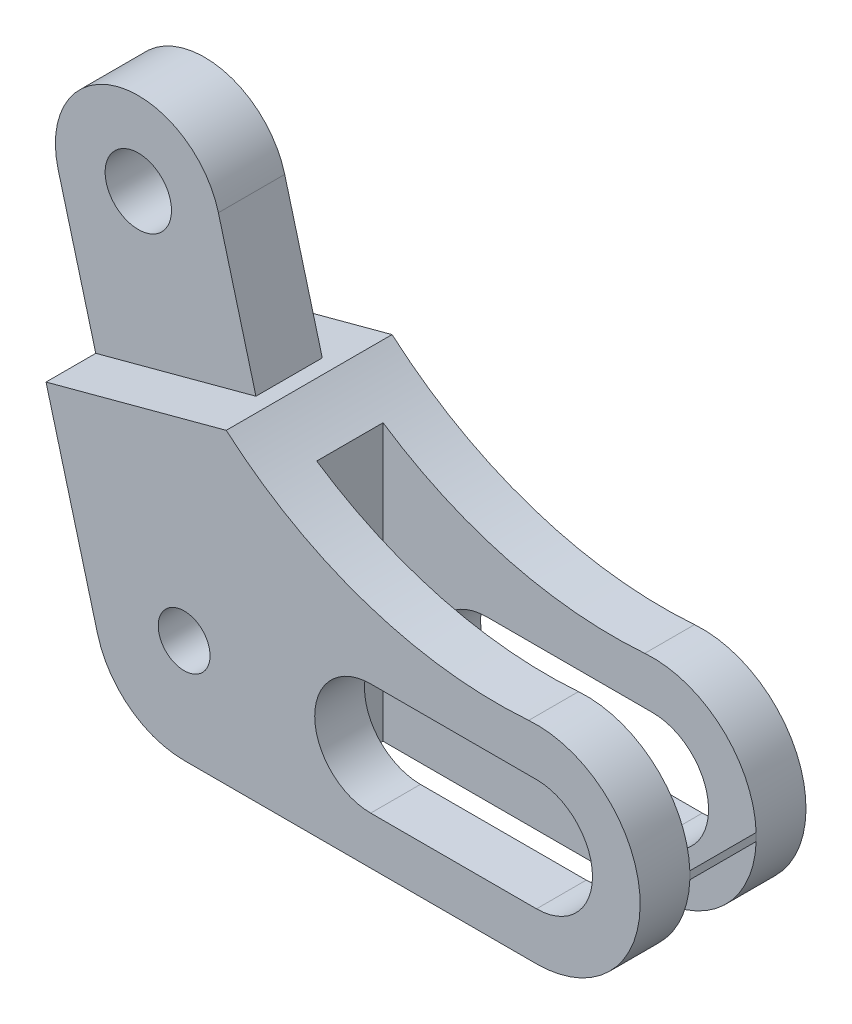
ISO-10303-21;
HEADER;
FILE_DESCRIPTION(('STEP AP214'),'2;1');
FILE_NAME('part.step','',(''),(''),'','','');
FILE_SCHEMA(('AUTOMOTIVE_DESIGN { 1 0 10303 214 1 1 1 1 }'));
ENDSEC;
DATA;
#1=APPLICATION_CONTEXT('core data for automotive mechanical design processes');
#2=APPLICATION_PROTOCOL_DEFINITION('international standard','automotive_design',2000,#1);
#3=PRODUCT_CONTEXT('',#1,'mechanical');
#4=PRODUCT('Part','Part','',(#3));
#5=PRODUCT_RELATED_PRODUCT_CATEGORY('part','',(#4));
#6=PRODUCT_DEFINITION_FORMATION('','',#4);
#7=PRODUCT_DEFINITION_CONTEXT('part definition',#1,'design');
#8=PRODUCT_DEFINITION('design','',#6,#7);
#9=PRODUCT_DEFINITION_SHAPE('','',#8);
#10=(LENGTH_UNIT() NAMED_UNIT(*) SI_UNIT(.MILLI.,.METRE.));
#11=(NAMED_UNIT(*) PLANE_ANGLE_UNIT() SI_UNIT($,.RADIAN.));
#12=(NAMED_UNIT(*) SI_UNIT($,.STERADIAN.) SOLID_ANGLE_UNIT());
#13=UNCERTAINTY_MEASURE_WITH_UNIT(LENGTH_MEASURE(1.E-05),#10,'distance_accuracy_value','');
#14=(GEOMETRIC_REPRESENTATION_CONTEXT(3) GLOBAL_UNCERTAINTY_ASSIGNED_CONTEXT((#13)) GLOBAL_UNIT_ASSIGNED_CONTEXT((#10,
#11,#12)) REPRESENTATION_CONTEXT('',''));
#15=CARTESIAN_POINT('',(0.,0.,0.));
#16=DIRECTION('',(0.,0.,1.));
#17=DIRECTION('',(1.,0.,0.));
#18=AXIS2_PLACEMENT_3D('',#15,#16,#17);
#19=CARTESIAN_POINT('',(85.,0.00279642058165219,20.));
#20=DIRECTION('',(0.,0.,-1.));
#21=DIRECTION('',(-1.,0.,0.));
#22=AXIS2_PLACEMENT_3D('',#19,#20,#21);
#23=CYLINDRICAL_SURFACE('',#22,13.5);
#24=DIRECTION('',(0.,0.,-1.));
#25=VECTOR('',#24,1.);
#26=CARTESIAN_POINT('',(85.0009437919463,-13.4972035464279,20.));
#27=LINE('',#26,#25);
#28=CARTESIAN_POINT('',(85.0009437919463,-13.4972035464279,-8.));
#29=VERTEX_POINT('',#28);
#30=CARTESIAN_POINT('',(85.0009437919463,-13.4972035464279,-20.));
#31=VERTEX_POINT('',#30);
#32=EDGE_CURVE('E290',#29,#31,#27,.T.);
#33=ORIENTED_EDGE('',*,*,#32,.F.);
#34=CARTESIAN_POINT('',(85.,0.00279642058165219,-7.99999999999999));
#35=DIRECTION('',(0.,0.,1.));
#36=DIRECTION('',(0.,-1.,0.));
#37=AXIS2_PLACEMENT_3D('',#34,#35,#36);
#38=CIRCLE('',#37,13.5);
#39=CARTESIAN_POINT('',(84.9990562080537,13.5027963875912,-8.));
#40=VERTEX_POINT('',#39);
#41=EDGE_CURVE('E218',#29,#40,#38,.T.);
#42=ORIENTED_EDGE('',*,*,#41,.T.);
#43=DIRECTION('',(0.,0.,-1.));
#44=VECTOR('',#43,1.);
#45=CARTESIAN_POINT('',(84.9990562080537,13.5027963875912,20.));
#46=LINE('',#45,#44);
#47=CARTESIAN_POINT('',(84.9990562080537,13.5027963875912,-20.));
#48=VERTEX_POINT('',#47);
#49=EDGE_CURVE('E310',#40,#48,#46,.T.);
#50=ORIENTED_EDGE('',*,*,#49,.T.);
#51=CARTESIAN_POINT('',(85.,0.00279642058165219,-20.));
#52=DIRECTION('',(0.,0.,1.));
#53=DIRECTION('',(1.,0.,0.));
#54=AXIS2_PLACEMENT_3D('',#51,#52,#53);
#55=CIRCLE('',#54,13.5);
#56=EDGE_CURVE('E277',#31,#48,#55,.T.);
#57=ORIENTED_EDGE('',*,*,#56,.F.);
#58=EDGE_LOOP('',(#33,#42,#50,#57));
#59=FACE_BOUND('',#58,.T.);
#60=ADVANCED_FACE('F39',(#59),#23,.F.);
#61=CARTESIAN_POINT('',(84.9990562080537,13.5027963875912,20.));
#62=DIRECTION('',(6.99105145414783E-05,-0.99999999755626,0.));
#63=DIRECTION('',(0.99999999755626,6.99105145414783E-05,0.));
#64=AXIS2_PLACEMENT_3D('',#61,#62,#63);
#65=PLANE('',#64);
#66=ORIENTED_EDGE('',*,*,#49,.F.);
#67=DIRECTION('',(-0.99999999755626,-6.99105145414783E-05,0.));
#68=VECTOR('',#67,1.);
#69=CARTESIAN_POINT('',(84.9990562080537,13.5027963875912,-8.));
#70=LINE('',#69,#68);
#71=CARTESIAN_POINT('',(44.9990563058033,13.4999999670095,-7.99999999999999));
#72=VERTEX_POINT('',#71);
#73=EDGE_CURVE('E392',#40,#72,#70,.T.);
#74=ORIENTED_EDGE('',*,*,#73,.T.);
#75=DIRECTION('',(0.,0.,-1.));
#76=VECTOR('',#75,1.);
#77=CARTESIAN_POINT('',(44.9990563058033,13.4999999670095,20.));
#78=LINE('',#77,#76);
#79=CARTESIAN_POINT('',(44.9990563058033,13.4999999670095,-20.));
#80=VERTEX_POINT('',#79);
#81=EDGE_CURVE('E303',#72,#80,#78,.T.);
#82=ORIENTED_EDGE('',*,*,#81,.T.);
#83=DIRECTION('',(-0.99999999755626,-6.99105145414783E-05,0.));
#84=VECTOR('',#83,1.);
#85=CARTESIAN_POINT('',(84.9990562080537,13.5027963875912,-20.));
#86=LINE('',#85,#84);
#87=EDGE_CURVE('E288',#48,#80,#86,.T.);
#88=ORIENTED_EDGE('',*,*,#87,.F.);
#89=EDGE_LOOP('',(#66,#74,#82,#88));
#90=FACE_BOUND('',#89,.T.);
#91=ADVANCED_FACE('F404',(#90),#65,.T.);
#92=CARTESIAN_POINT('',(45.0000000977496,0.,20.));
#93=DIRECTION('',(0.,0.,-1.));
#94=DIRECTION('',(-1.,0.,0.));
#95=AXIS2_PLACEMENT_3D('',#92,#93,#94);
#96=CYLINDRICAL_SURFACE('',#95,13.5);
#97=ORIENTED_EDGE('',*,*,#81,.F.);
#98=CARTESIAN_POINT('',(45.0000000977496,0.,-7.99999999999999));
#99=DIRECTION('',(0.,0.,1.));
#100=DIRECTION('',(0.,-1.,0.));
#101=AXIS2_PLACEMENT_3D('',#98,#99,#100);
#102=CIRCLE('',#101,13.5);
#103=CARTESIAN_POINT('',(45.0009438896959,-13.4999999670095,-8.));
#104=VERTEX_POINT('',#103);
#105=EDGE_CURVE('E389',#72,#104,#102,.T.);
#106=ORIENTED_EDGE('',*,*,#105,.T.);
#107=DIRECTION('',(0.,0.,-1.));
#108=VECTOR('',#107,1.);
#109=CARTESIAN_POINT('',(45.0009438896959,-13.4999999670095,20.));
#110=LINE('',#109,#108);
#111=CARTESIAN_POINT('',(45.0009438896959,-13.4999999670095,-20.));
#112=VERTEX_POINT('',#111);
#113=EDGE_CURVE('E302',#104,#112,#110,.T.);
#114=ORIENTED_EDGE('',*,*,#113,.T.);
#115=CARTESIAN_POINT('',(45.0000000977496,0.,-20.));
#116=DIRECTION('',(0.,0.,1.));
#117=DIRECTION('',(1.,0.,0.));
#118=AXIS2_PLACEMENT_3D('',#115,#116,#117);
#119=CIRCLE('',#118,13.5);
#120=EDGE_CURVE('E291',#80,#112,#119,.T.);
#121=ORIENTED_EDGE('',*,*,#120,.F.);
#122=EDGE_LOOP('',(#97,#106,#114,#121));
#123=FACE_BOUND('',#122,.T.);
#124=ADVANCED_FACE('F411',(#123),#96,.F.);
#125=CARTESIAN_POINT('',(85.0009437919463,-13.4972035464279,20.));
#126=DIRECTION('',(-6.99105145413048E-05,0.99999999755626,0.));
#127=DIRECTION('',(-0.99999999755626,-6.99105145413048E-05,0.));
#128=AXIS2_PLACEMENT_3D('',#125,#126,#127);
#129=PLANE('',#128);
#130=ORIENTED_EDGE('',*,*,#113,.F.);
#131=DIRECTION('',(0.99999999755626,6.99105145413048E-05,0.));
#132=VECTOR('',#131,1.);
#133=CARTESIAN_POINT('',(85.0009437919463,-13.4972035464279,-8.));
#134=LINE('',#133,#132);
#135=EDGE_CURVE('E370',#104,#29,#134,.T.);
#136=ORIENTED_EDGE('',*,*,#135,.T.);
#137=ORIENTED_EDGE('',*,*,#32,.T.);
#138=DIRECTION('',(0.99999999755626,6.99105145413048E-05,0.));
#139=VECTOR('',#138,1.);
#140=CARTESIAN_POINT('',(85.0009437919463,-13.4972035464279,-20.));
#141=LINE('',#140,#139);
#142=EDGE_CURVE('E278',#112,#31,#141,.T.);
#143=ORIENTED_EDGE('',*,*,#142,.F.);
#144=EDGE_LOOP('',(#130,#136,#137,#143));
#145=FACE_BOUND('',#144,.T.);
#146=ADVANCED_FACE('F415',(#145),#129,.T.);
#147=CARTESIAN_POINT('',(0.,-3.37299546552138,20.));
#148=DIRECTION('',(0.,0.,1.));
#149=DIRECTION('',(1.,0.,0.));
#150=AXIS2_PLACEMENT_3D('',#147,#148,#149);
#151=PLANE('',#150);
#152=CARTESIAN_POINT('',(0.,-3.37299546552138,20.));
#153=DIRECTION('',(0.,0.,1.));
#154=DIRECTION('',(1.,0.,0.));
#155=AXIS2_PLACEMENT_3D('',#152,#153,#154);
#156=CIRCLE('',#155,21.6270045344786);
#157=CARTESIAN_POINT('',(-20.8900822251237,-8.97047612756289,20.));
#158=VERTEX_POINT('',#157);
#159=CARTESIAN_POINT('',(0.,-25.,20.));
#160=VERTEX_POINT('',#159);
#161=EDGE_CURVE('E319',#158,#160,#156,.T.);
#162=ORIENTED_EDGE('',*,*,#161,.T.);
#163=DIRECTION('',(1.,0.,0.));
#164=VECTOR('',#163,1.);
#165=CARTESIAN_POINT('',(0.,-25.,20.));
#166=LINE('',#165,#164);
#167=CARTESIAN_POINT('',(85.,-25.,20.));
#168=VERTEX_POINT('',#167);
#169=EDGE_CURVE('E323',#160,#168,#166,.T.);
#170=ORIENTED_EDGE('',*,*,#169,.T.);
#171=CARTESIAN_POINT('',(85.,0.00279642058165219,20.));
#172=DIRECTION('',(0.,0.,1.));
#173=DIRECTION('',(1.,0.,0.));
#174=AXIS2_PLACEMENT_3D('',#171,#172,#173);
#175=CIRCLE('',#174,25.0027964205816);
#176=CARTESIAN_POINT('',(83.1194466102918,24.9347708269039,20.));
#177=VERTEX_POINT('',#176);
#178=EDGE_CURVE('E326',#168,#177,#175,.T.);
#179=ORIENTED_EDGE('',*,*,#178,.T.);
#180=CARTESIAN_POINT('',(75.5980743682647,124.651514454024,20.));
#181=DIRECTION('',(0.,0.,-1.));
#182=DIRECTION('',(-1.,0.,0.));
#183=AXIS2_PLACEMENT_3D('',#180,#181,#182);
#184=CIRCLE('',#183,100.);
#185=CARTESIAN_POINT('',(10.1532657929637,49.0408205639256,20.));
#186=VERTEX_POINT('',#185);
#187=EDGE_CURVE('E327',#177,#186,#184,.T.);
#188=ORIENTED_EDGE('',*,*,#187,.T.);
#189=DIRECTION('',(-0.96592582628907,-0.258819045102515,0.));
#190=VECTOR('',#189,1.);
#191=CARTESIAN_POINT('',(10.1532657929637,49.0408205639256,20.));
#192=LINE('',#191,#190);
#193=CARTESIAN_POINT('',(-33.3133963900444,37.3939635343125,20.));
#194=VERTEX_POINT('',#193);
#195=EDGE_CURVE('E329',#186,#194,#192,.T.);
#196=ORIENTED_EDGE('',*,*,#195,.T.);
#197=DIRECTION('',(0.258819045102515,-0.96592582628907,0.));
#198=VECTOR('',#197,1.);
#199=CARTESIAN_POINT('',(-33.3133963900444,37.3939635343125,20.));
#200=LINE('',#199,#198);
#201=EDGE_CURVE('E335',#194,#158,#200,.T.);
#202=ORIENTED_EDGE('',*,*,#201,.T.);
#203=EDGE_LOOP('',(#162,#170,#179,#188,#196,#202));
#204=FACE_BOUND('',#203,.T.);
#205=CARTESIAN_POINT('',(0.,0.,20.));
#206=DIRECTION('',(0.,0.,1.));
#207=DIRECTION('',(1.,0.,0.));
#208=AXIS2_PLACEMENT_3D('',#205,#206,#207);
#209=CIRCLE('',#208,6.25);
#210=CARTESIAN_POINT('',(6.25,0.,20.));
#211=VERTEX_POINT('',#210);
#212=EDGE_CURVE('E314',#211,#211,#209,.T.);
#213=ORIENTED_EDGE('',*,*,#212,.F.);
#214=EDGE_LOOP('',(#213));
#215=FACE_BOUND('',#214,.T.);
#216=DIRECTION('',(-0.99999999755626,-6.99105145414783E-05,0.));
#217=VECTOR('',#216,1.);
#218=CARTESIAN_POINT('',(84.9990562080537,13.5027963875912,20.));
#219=LINE('',#218,#217);
#220=CARTESIAN_POINT('',(84.9990562080537,13.5027963875912,20.));
#221=VERTEX_POINT('',#220);
#222=CARTESIAN_POINT('',(44.9990563058033,13.4999999670095,20.));
#223=VERTEX_POINT('',#222);
#224=EDGE_CURVE('E276',#221,#223,#219,.T.);
#225=ORIENTED_EDGE('',*,*,#224,.F.);
#226=CARTESIAN_POINT('',(85.,0.00279642058165219,20.));
#227=DIRECTION('',(0.,0.,1.));
#228=DIRECTION('',(1.,0.,0.));
#229=AXIS2_PLACEMENT_3D('',#226,#227,#228);
#230=CIRCLE('',#229,13.5);
#231=CARTESIAN_POINT('',(85.0009437919463,-13.4972035464279,20.));
#232=VERTEX_POINT('',#231);
#233=EDGE_CURVE('E280',#232,#221,#230,.T.);
#234=ORIENTED_EDGE('',*,*,#233,.F.);
#235=DIRECTION('',(0.99999999755626,6.99105145413048E-05,0.));
#236=VECTOR('',#235,1.);
#237=CARTESIAN_POINT('',(85.0009437919463,-13.4972035464279,20.));
#238=LINE('',#237,#236);
#239=CARTESIAN_POINT('',(45.0009438896959,-13.4999999670095,20.));
#240=VERTEX_POINT('',#239);
#241=EDGE_CURVE('E283',#240,#232,#238,.T.);
#242=ORIENTED_EDGE('',*,*,#241,.F.);
#243=CARTESIAN_POINT('',(45.0000000977496,0.,20.));
#244=DIRECTION('',(0.,0.,1.));
#245=DIRECTION('',(1.,0.,0.));
#246=AXIS2_PLACEMENT_3D('',#243,#244,#245);
#247=CIRCLE('',#246,13.5);
#248=EDGE_CURVE('E285',#223,#240,#247,.T.);
#249=ORIENTED_EDGE('',*,*,#248,.F.);
#250=EDGE_LOOP('',(#225,#234,#242,#249));
#251=FACE_BOUND('',#250,.T.);
#252=ADVANCED_FACE('F425',(#204,#215,#251),#151,.T.);
#253=CARTESIAN_POINT('',(0.,-3.37299546552138,-20.));
#254=DIRECTION('',(0.,0.,1.));
#255=DIRECTION('',(1.,0.,0.));
#256=AXIS2_PLACEMENT_3D('',#253,#254,#255);
#257=PLANE('',#256);
#258=CARTESIAN_POINT('',(0.,0.,-20.));
#259=DIRECTION('',(0.,0.,1.));
#260=DIRECTION('',(1.,0.,0.));
#261=AXIS2_PLACEMENT_3D('',#258,#259,#260);
#262=CIRCLE('',#261,6.25);
#263=CARTESIAN_POINT('',(6.25,0.,-20.));
#264=VERTEX_POINT('',#263);
#265=EDGE_CURVE('E311',#264,#264,#262,.T.);
#266=ORIENTED_EDGE('',*,*,#265,.T.);
#267=EDGE_LOOP('',(#266));
#268=FACE_BOUND('',#267,.T.);
#269=CARTESIAN_POINT('',(0.,-3.37299546552138,-20.));
#270=DIRECTION('',(0.,0.,1.));
#271=DIRECTION('',(1.,0.,0.));
#272=AXIS2_PLACEMENT_3D('',#269,#270,#271);
#273=CIRCLE('',#272,21.6270045344786);
#274=CARTESIAN_POINT('',(-20.8900822251237,-8.97047612756289,-20.));
#275=VERTEX_POINT('',#274);
#276=CARTESIAN_POINT('',(0.,-25.,-20.));
#277=VERTEX_POINT('',#276);
#278=EDGE_CURVE('E320',#275,#277,#273,.T.);
#279=ORIENTED_EDGE('',*,*,#278,.F.);
#280=DIRECTION('',(0.258819045102515,-0.96592582628907,0.));
#281=VECTOR('',#280,1.);
#282=CARTESIAN_POINT('',(-33.3133963900444,37.3939635343125,-20.));
#283=LINE('',#282,#281);
#284=CARTESIAN_POINT('',(-33.3133963900444,37.3939635343125,-20.));
#285=VERTEX_POINT('',#284);
#286=EDGE_CURVE('E322',#285,#275,#283,.T.);
#287=ORIENTED_EDGE('',*,*,#286,.F.);
#288=DIRECTION('',(-0.96592582628907,-0.258819045102515,0.));
#289=VECTOR('',#288,1.);
#290=CARTESIAN_POINT('',(10.1532657929637,49.0408205639256,-20.));
#291=LINE('',#290,#289);
#292=CARTESIAN_POINT('',(10.1532657929637,49.0408205639256,-20.));
#293=VERTEX_POINT('',#292);
#294=EDGE_CURVE('E341',#293,#285,#291,.T.);
#295=ORIENTED_EDGE('',*,*,#294,.F.);
#296=CARTESIAN_POINT('',(75.5980743682647,124.651514454024,-20.));
#297=DIRECTION('',(0.,0.,-1.));
#298=DIRECTION('',(-1.,0.,0.));
#299=AXIS2_PLACEMENT_3D('',#296,#297,#298);
#300=CIRCLE('',#299,100.);
#301=CARTESIAN_POINT('',(83.1194466102918,24.9347708269039,-20.));
#302=VERTEX_POINT('',#301);
#303=EDGE_CURVE('E345',#302,#293,#300,.T.);
#304=ORIENTED_EDGE('',*,*,#303,.F.);
#305=CARTESIAN_POINT('',(85.,0.00279642058165219,-20.));
#306=DIRECTION('',(0.,0.,1.));
#307=DIRECTION('',(1.,0.,0.));
#308=AXIS2_PLACEMENT_3D('',#305,#306,#307);
#309=CIRCLE('',#308,25.0027964205816);
#310=CARTESIAN_POINT('',(85.,-25.,-20.));
#311=VERTEX_POINT('',#310);
#312=EDGE_CURVE('E338',#311,#302,#309,.T.);
#313=ORIENTED_EDGE('',*,*,#312,.F.);
#314=DIRECTION('',(1.,0.,0.));
#315=VECTOR('',#314,1.);
#316=CARTESIAN_POINT('',(0.,-25.,-20.));
#317=LINE('',#316,#315);
#318=EDGE_CURVE('E340',#277,#311,#317,.T.);
#319=ORIENTED_EDGE('',*,*,#318,.F.);
#320=EDGE_LOOP('',(#279,#287,#295,#304,#313,#319));
#321=FACE_BOUND('',#320,.T.);
#322=ORIENTED_EDGE('',*,*,#56,.T.);
#323=ORIENTED_EDGE('',*,*,#87,.T.);
#324=ORIENTED_EDGE('',*,*,#120,.T.);
#325=ORIENTED_EDGE('',*,*,#142,.T.);
#326=EDGE_LOOP('',(#322,#323,#324,#325));
#327=FACE_BOUND('',#326,.T.);
#328=ADVANCED_FACE('F409',(#268,#321,#327),#257,.F.);
#329=CARTESIAN_POINT('',(0.,-3.37299546552138,20.));
#330=DIRECTION('',(0.,0.,-1.));
#331=DIRECTION('',(-1.,0.,0.));
#332=AXIS2_PLACEMENT_3D('',#329,#330,#331);
#333=CYLINDRICAL_SURFACE('',#332,21.6270045344786);
#334=ORIENTED_EDGE('',*,*,#278,.T.);
#335=DIRECTION('',(0.,0.,-1.));
#336=VECTOR('',#335,1.);
#337=CARTESIAN_POINT('',(0.,-25.,20.));
#338=LINE('',#337,#336);
#339=EDGE_CURVE('E365',#160,#277,#338,.T.);
#340=ORIENTED_EDGE('',*,*,#339,.F.);
#341=ORIENTED_EDGE('',*,*,#161,.F.);
#342=DIRECTION('',(0.,0.,-1.));
#343=VECTOR('',#342,1.);
#344=CARTESIAN_POINT('',(-20.8900822251237,-8.97047612756289,20.));
#345=LINE('',#344,#343);
#346=EDGE_CURVE('E331',#158,#275,#345,.T.);
#347=ORIENTED_EDGE('',*,*,#346,.T.);
#348=EDGE_LOOP('',(#334,#340,#341,#347));
#349=FACE_BOUND('',#348,.T.);
#350=ADVANCED_FACE('F41',(#349),#333,.T.);
#351=CARTESIAN_POINT('',(0.,-25.,20.));
#352=DIRECTION('',(0.,1.,0.));
#353=DIRECTION('',(0.,0.,1.));
#354=AXIS2_PLACEMENT_3D('',#351,#352,#353);
#355=PLANE('',#354);
#356=DIRECTION('',(0.,0.,1.));
#357=VECTOR('',#356,1.);
#358=CARTESIAN_POINT('',(19.9850846435777,-25.,20.));
#359=LINE('',#358,#357);
#360=CARTESIAN_POINT('',(19.9850846435777,-25.,-8.));
#361=VERTEX_POINT('',#360);
#362=CARTESIAN_POINT('',(19.9850846435777,-25.,8.));
#363=VERTEX_POINT('',#362);
#364=EDGE_CURVE('E239',#361,#363,#359,.T.);
#365=ORIENTED_EDGE('',*,*,#364,.T.);
#366=DIRECTION('',(1.,0.,0.));
#367=VECTOR('',#366,1.);
#368=CARTESIAN_POINT('',(0.,-25.,8.));
#369=LINE('',#368,#367);
#370=CARTESIAN_POINT('',(85.,-25.,8.));
#371=VERTEX_POINT('',#370);
#372=EDGE_CURVE('E237',#363,#371,#369,.T.);
#373=ORIENTED_EDGE('',*,*,#372,.T.);
#374=DIRECTION('',(0.,0.,-1.));
#375=VECTOR('',#374,1.);
#376=CARTESIAN_POINT('',(85.,-25.,20.));
#377=LINE('',#376,#375);
#378=EDGE_CURVE('E363',#168,#371,#377,.T.);
#379=ORIENTED_EDGE('',*,*,#378,.F.);
#380=ORIENTED_EDGE('',*,*,#169,.F.);
#381=ORIENTED_EDGE('',*,*,#339,.T.);
#382=ORIENTED_EDGE('',*,*,#318,.T.);
#383=CARTESIAN_POINT('',(85.,-25.,-8.));
#384=VERTEX_POINT('',#383);
#385=EDGE_CURVE('E358',#384,#311,#377,.T.);
#386=ORIENTED_EDGE('',*,*,#385,.F.);
#387=DIRECTION('',(1.,0.,0.));
#388=VECTOR('',#387,1.);
#389=CARTESIAN_POINT('',(0.,-25.,-8.));
#390=LINE('',#389,#388);
#391=EDGE_CURVE('E217',#361,#384,#390,.T.);
#392=ORIENTED_EDGE('',*,*,#391,.F.);
#393=EDGE_LOOP('',(#365,#373,#379,#380,#381,#382,#386,#392));
#394=FACE_BOUND('',#393,.T.);
#395=ADVANCED_FACE('F382',(#394),#355,.F.);
#396=CARTESIAN_POINT('',(85.,0.00279642058165219,20.));
#397=DIRECTION('',(0.,0.,-1.));
#398=DIRECTION('',(-1.,0.,0.));
#399=AXIS2_PLACEMENT_3D('',#396,#397,#398);
#400=CYLINDRICAL_SURFACE('',#399,25.0027964205816);
#401=DIRECTION('',(0.,0.,-1.));
#402=VECTOR('',#401,1.);
#403=CARTESIAN_POINT('',(109.985084643578,0.943739671958631,20.));
#404=LINE('',#403,#402);
#405=CARTESIAN_POINT('',(109.985084643578,0.943739671958627,8.00000000000001));
#406=VERTEX_POINT('',#405);
#407=CARTESIAN_POINT('',(109.985084643578,0.943739671958627,-7.99999999999999));
#408=VERTEX_POINT('',#407);
#409=EDGE_CURVE('E11',#406,#408,#404,.T.);
#410=ORIENTED_EDGE('',*,*,#409,.F.);
#411=CARTESIAN_POINT('',(85.,0.00279642058165219,8.00000000000001));
#412=DIRECTION('',(0.,0.,1.));
#413=DIRECTION('',(0.,-1.,0.));
#414=AXIS2_PLACEMENT_3D('',#411,#412,#413);
#415=CIRCLE('',#414,25.0027964205816);
#416=CARTESIAN_POINT('',(83.1194466102918,24.9347708269039,8.00000000000001));
#417=VERTEX_POINT('',#416);
#418=EDGE_CURVE('E234',#406,#417,#415,.T.);
#419=ORIENTED_EDGE('',*,*,#418,.T.);
#420=DIRECTION('',(0.,0.,-1.));
#421=VECTOR('',#420,1.);
#422=CARTESIAN_POINT('',(83.1194466102918,24.9347708269039,20.));
#423=LINE('',#422,#421);
#424=EDGE_CURVE('E360',#177,#417,#423,.T.);
#425=ORIENTED_EDGE('',*,*,#424,.F.);
#426=ORIENTED_EDGE('',*,*,#178,.F.);
#427=ORIENTED_EDGE('',*,*,#378,.T.);
#428=CARTESIAN_POINT('',(109.985084643578,-0.938146830795322,8.00000000000001));
#429=VERTEX_POINT('',#428);
#430=EDGE_CURVE('E233',#371,#429,#415,.T.);
#431=ORIENTED_EDGE('',*,*,#430,.T.);
#432=DIRECTION('',(0.,0.,-1.));
#433=VECTOR('',#432,1.);
#434=CARTESIAN_POINT('',(109.985084643578,-0.938146830795327,20.));
#435=LINE('',#434,#433);
#436=CARTESIAN_POINT('',(109.985084643578,-0.938146830795327,-8.00000000000002));
#437=VERTEX_POINT('',#436);
#438=EDGE_CURVE('E50',#437,#429,#435,.F.);
#439=ORIENTED_EDGE('',*,*,#438,.F.);
#440=CARTESIAN_POINT('',(85.,0.00279642058165219,-7.99999999999999));
#441=DIRECTION('',(0.,0.,1.));
#442=DIRECTION('',(0.,-1.,0.));
#443=AXIS2_PLACEMENT_3D('',#440,#441,#442);
#444=CIRCLE('',#443,25.0027964205816);
#445=EDGE_CURVE('E207',#384,#437,#444,.T.);
#446=ORIENTED_EDGE('',*,*,#445,.F.);
#447=ORIENTED_EDGE('',*,*,#385,.T.);
#448=ORIENTED_EDGE('',*,*,#312,.T.);
#449=CARTESIAN_POINT('',(83.1194466102918,24.9347708269039,-7.99999999999999));
#450=VERTEX_POINT('',#449);
#451=EDGE_CURVE('E214',#450,#302,#423,.T.);
#452=ORIENTED_EDGE('',*,*,#451,.F.);
#453=EDGE_CURVE('E206',#408,#450,#444,.T.);
#454=ORIENTED_EDGE('',*,*,#453,.F.);
#455=EDGE_LOOP('',(#410,#419,#425,#426,#427,#431,#439,#446,#447,#448,#452,#454));
#456=FACE_BOUND('',#455,.T.);
#457=ADVANCED_FACE('F213',(#456),#400,.T.);
#458=CARTESIAN_POINT('',(75.5980743682647,124.651514454024,20.));
#459=DIRECTION('',(0.,0.,-1.));
#460=DIRECTION('',(-1.,0.,0.));
#461=AXIS2_PLACEMENT_3D('',#458,#459,#460);
#462=CYLINDRICAL_SURFACE('',#461,100.);
#463=ORIENTED_EDGE('',*,*,#424,.T.);
#464=CARTESIAN_POINT('',(75.5980743682647,124.651514454024,8.00000000000002));
#465=DIRECTION('',(0.,0.,1.));
#466=DIRECTION('',(0.,-1.,0.));
#467=AXIS2_PLACEMENT_3D('',#464,#465,#466);
#468=CIRCLE('',#467,100.);
#469=CARTESIAN_POINT('',(19.9850846435777,41.5419760490864,8.00000000000001));
#470=VERTEX_POINT('',#469);
#471=EDGE_CURVE('E228',#417,#470,#468,.F.);
#472=ORIENTED_EDGE('',*,*,#471,.T.);
#473=DIRECTION('',(0.,0.,-1.));
#474=VECTOR('',#473,1.);
#475=CARTESIAN_POINT('',(19.9850846435777,41.5419760490864,20.));
#476=LINE('',#475,#474);
#477=CARTESIAN_POINT('',(19.9850846435777,41.5419760490864,-8.00000000000002));
#478=VERTEX_POINT('',#477);
#479=EDGE_CURVE('E375',#470,#478,#476,.T.);
#480=ORIENTED_EDGE('',*,*,#479,.T.);
#481=CARTESIAN_POINT('',(75.5980743682647,124.651514454024,-7.99999999999998));
#482=DIRECTION('',(0.,0.,1.));
#483=DIRECTION('',(0.,-1.,0.));
#484=AXIS2_PLACEMENT_3D('',#481,#482,#483);
#485=CIRCLE('',#484,100.);
#486=EDGE_CURVE('E216',#450,#478,#485,.F.);
#487=ORIENTED_EDGE('',*,*,#486,.F.);
#488=ORIENTED_EDGE('',*,*,#451,.T.);
#489=ORIENTED_EDGE('',*,*,#303,.T.);
#490=DIRECTION('',(0.,0.,-1.));
#491=VECTOR('',#490,1.);
#492=CARTESIAN_POINT('',(10.1532657929637,49.0408205639256,20.));
#493=LINE('',#492,#491);
#494=EDGE_CURVE('E351',#186,#293,#493,.T.);
#495=ORIENTED_EDGE('',*,*,#494,.F.);
#496=ORIENTED_EDGE('',*,*,#187,.F.);
#497=EDGE_LOOP('',(#463,#472,#480,#487,#488,#489,#495,#496));
#498=FACE_BOUND('',#497,.T.);
#499=ADVANCED_FACE('F599',(#498),#462,.F.);
#500=CARTESIAN_POINT('',(10.1532657929637,49.0408205639256,20.));
#501=DIRECTION('',(0.258819045102515,-0.96592582628907,0.));
#502=DIRECTION('',(0.96592582628907,0.258819045102515,0.));
#503=AXIS2_PLACEMENT_3D('',#500,#501,#502);
#504=PLANE('',#503);
#505=DIRECTION('',(0.,0.,-1.));
#506=VECTOR('',#505,1.);
#507=CARTESIAN_POINT('',(-33.3133963900444,37.3939635343125,20.));
#508=LINE('',#507,#506);
#509=CARTESIAN_POINT('',(-33.3133963900444,37.3939635343125,-8.));
#510=VERTEX_POINT('',#509);
#511=EDGE_CURVE('E348',#510,#285,#508,.T.);
#512=ORIENTED_EDGE('',*,*,#511,.F.);
#513=DIRECTION('',(0.96592582628907,0.258819045102514,0.));
#514=VECTOR('',#513,1.);
#515=CARTESIAN_POINT('',(-33.3133963900444,37.3939635343125,-8.));
#516=LINE('',#515,#514);
#517=CARTESIAN_POINT('',(5.32363666151838,47.746725338413,-8.));
#518=VERTEX_POINT('',#517);
#519=EDGE_CURVE('E247',#510,#518,#516,.T.);
#520=ORIENTED_EDGE('',*,*,#519,.T.);
#521=DIRECTION('',(0.,0.,-1.));
#522=VECTOR('',#521,1.);
#523=CARTESIAN_POINT('',(5.32363666151838,47.746725338413,8.));
#524=LINE('',#523,#522);
#525=CARTESIAN_POINT('',(5.32363666151838,47.746725338413,8.));
#526=VERTEX_POINT('',#525);
#527=EDGE_CURVE('E272',#526,#518,#524,.T.);
#528=ORIENTED_EDGE('',*,*,#527,.F.);
#529=DIRECTION('',(0.96592582628907,0.258819045102514,0.));
#530=VECTOR('',#529,1.);
#531=CARTESIAN_POINT('',(-33.3133963900444,37.3939635343125,8.));
#532=LINE('',#531,#530);
#533=CARTESIAN_POINT('',(-33.3133963900444,37.3939635343125,8.));
#534=VERTEX_POINT('',#533);
#535=EDGE_CURVE('E246',#534,#526,#532,.T.);
#536=ORIENTED_EDGE('',*,*,#535,.F.);
#537=EDGE_CURVE('E352',#194,#534,#508,.T.);
#538=ORIENTED_EDGE('',*,*,#537,.F.);
#539=ORIENTED_EDGE('',*,*,#195,.F.);
#540=ORIENTED_EDGE('',*,*,#494,.T.);
#541=ORIENTED_EDGE('',*,*,#294,.T.);
#542=EDGE_LOOP('',(#512,#520,#528,#536,#538,#539,#540,#541));
#543=FACE_BOUND('',#542,.T.);
#544=ADVANCED_FACE('F591',(#543),#504,.F.);
#545=CARTESIAN_POINT('',(-33.3133963900444,37.3939635343125,20.));
#546=DIRECTION('',(0.96592582628907,0.258819045102515,0.));
#547=DIRECTION('',(-0.258819045102515,0.96592582628907,0.));
#548=AXIS2_PLACEMENT_3D('',#545,#546,#547);
#549=PLANE('',#548);
#550=ORIENTED_EDGE('',*,*,#286,.T.);
#551=ORIENTED_EDGE('',*,*,#346,.F.);
#552=ORIENTED_EDGE('',*,*,#201,.F.);
#553=ORIENTED_EDGE('',*,*,#537,.T.);
#554=DIRECTION('',(0.258819045102515,-0.96592582628907,0.));
#555=VECTOR('',#554,1.);
#556=CARTESIAN_POINT('',(-33.3133963900444,37.3939635343125,8.));
#557=LINE('',#556,#555);
#558=CARTESIAN_POINT('',(-42.3720629686325,71.2013674544299,8.));
#559=VERTEX_POINT('',#558);
#560=EDGE_CURVE('E260',#559,#534,#557,.T.);
#561=ORIENTED_EDGE('',*,*,#560,.F.);
#562=DIRECTION('',(0.,0.,-1.));
#563=VECTOR('',#562,1.);
#564=CARTESIAN_POINT('',(-42.3720629686325,71.2013674544299,8.));
#565=LINE('',#564,#563);
#566=CARTESIAN_POINT('',(-42.3720629686325,71.2013674544299,-8.));
#567=VERTEX_POINT('',#566);
#568=EDGE_CURVE('E257',#559,#567,#565,.T.);
#569=ORIENTED_EDGE('',*,*,#568,.T.);
#570=DIRECTION('',(0.258819045102515,-0.96592582628907,0.));
#571=VECTOR('',#570,1.);
#572=CARTESIAN_POINT('',(-33.3133963900444,37.3939635343125,-8.));
#573=LINE('',#572,#571);
#574=EDGE_CURVE('E251',#567,#510,#573,.T.);
#575=ORIENTED_EDGE('',*,*,#574,.T.);
#576=ORIENTED_EDGE('',*,*,#511,.T.);
#577=EDGE_LOOP('',(#550,#551,#552,#553,#561,#569,#575,#576));
#578=FACE_BOUND('',#577,.T.);
#579=ADVANCED_FACE('F443',(#578),#549,.F.);
#580=CARTESIAN_POINT('',(0.,0.,20.));
#581=DIRECTION('',(0.,0.,-1.));
#582=DIRECTION('',(-1.,0.,0.));
#583=AXIS2_PLACEMENT_3D('',#580,#581,#582);
#584=CYLINDRICAL_SURFACE('',#583,6.25);
#585=ORIENTED_EDGE('',*,*,#212,.T.);
#586=EDGE_LOOP('',(#585));
#587=FACE_BOUND('',#586,.T.);
#588=ORIENTED_EDGE('',*,*,#265,.F.);
#589=EDGE_LOOP('',(#588));
#590=FACE_BOUND('',#589,.T.);
#591=ADVANCED_FACE('F440',(#587,#590),#584,.F.);
#592=CARTESIAN_POINT('',(85.,0.00279642058165219,8.00000000000001));
#593=DIRECTION('',(0.,0.,1.));
#594=DIRECTION('',(0.,-1.,0.));
#595=AXIS2_PLACEMENT_3D('',#592,#593,#594);
#596=CIRCLE('',#595,13.5);
#597=CARTESIAN_POINT('',(85.0009437919463,-13.4972035464279,8.));
#598=VERTEX_POINT('',#597);
#599=CARTESIAN_POINT('',(84.9990562080537,13.5027963875912,8.00000000000001));
#600=VERTEX_POINT('',#599);
#601=EDGE_CURVE('E229',#598,#600,#596,.T.);
#602=ORIENTED_EDGE('',*,*,#601,.F.);
#603=EDGE_CURVE('E299',#232,#598,#27,.T.);
#604=ORIENTED_EDGE('',*,*,#603,.F.);
#605=ORIENTED_EDGE('',*,*,#233,.T.);
#606=EDGE_CURVE('E309',#221,#600,#46,.T.);
#607=ORIENTED_EDGE('',*,*,#606,.T.);
#608=EDGE_LOOP('',(#602,#604,#605,#607));
#609=FACE_BOUND('',#608,.T.);
#610=ADVANCED_FACE('F431',(#609),#23,.F.);
#611=DIRECTION('',(-0.99999999755626,-6.99105145414783E-05,0.));
#612=VECTOR('',#611,1.);
#613=CARTESIAN_POINT('',(84.9990562080537,13.5027963875912,8.00000000000001));
#614=LINE('',#613,#612);
#615=CARTESIAN_POINT('',(44.9990563058033,13.4999999670095,8.00000000000001));
#616=VERTEX_POINT('',#615);
#617=EDGE_CURVE('E227',#600,#616,#614,.T.);
#618=ORIENTED_EDGE('',*,*,#617,.F.);
#619=ORIENTED_EDGE('',*,*,#606,.F.);
#620=ORIENTED_EDGE('',*,*,#224,.T.);
#621=EDGE_CURVE('E308',#223,#616,#78,.T.);
#622=ORIENTED_EDGE('',*,*,#621,.T.);
#623=EDGE_LOOP('',(#618,#619,#620,#622));
#624=FACE_BOUND('',#623,.T.);
#625=ADVANCED_FACE('F426',(#624),#65,.T.);
#626=CARTESIAN_POINT('',(45.0000000977496,0.,8.00000000000001));
#627=DIRECTION('',(0.,0.,1.));
#628=DIRECTION('',(0.,-1.,0.));
#629=AXIS2_PLACEMENT_3D('',#626,#627,#628);
#630=CIRCLE('',#629,13.5);
#631=CARTESIAN_POINT('',(45.0009438896959,-13.4999999670095,8.));
#632=VERTEX_POINT('',#631);
#633=EDGE_CURVE('E221',#616,#632,#630,.T.);
#634=ORIENTED_EDGE('',*,*,#633,.F.);
#635=ORIENTED_EDGE('',*,*,#621,.F.);
#636=ORIENTED_EDGE('',*,*,#248,.T.);
#637=EDGE_CURVE('E305',#240,#632,#110,.T.);
#638=ORIENTED_EDGE('',*,*,#637,.T.);
#639=EDGE_LOOP('',(#634,#635,#636,#638));
#640=FACE_BOUND('',#639,.T.);
#641=ADVANCED_FACE('F417',(#640),#96,.F.);
#642=DIRECTION('',(0.99999999755626,6.99105145413048E-05,0.));
#643=VECTOR('',#642,1.);
#644=CARTESIAN_POINT('',(85.0009437919463,-13.4972035464279,8.));
#645=LINE('',#644,#643);
#646=EDGE_CURVE('E367',#632,#598,#645,.T.);
#647=ORIENTED_EDGE('',*,*,#646,.F.);
#648=ORIENTED_EDGE('',*,*,#637,.F.);
#649=ORIENTED_EDGE('',*,*,#241,.T.);
#650=ORIENTED_EDGE('',*,*,#603,.T.);
#651=EDGE_LOOP('',(#647,#648,#649,#650));
#652=FACE_BOUND('',#651,.T.);
#653=ADVANCED_FACE('F424',(#652),#129,.T.);
#654=CARTESIAN_POINT('',(-23.0535464428511,76.3777483564802,8.));
#655=DIRECTION('',(0.,0.,1.));
#656=DIRECTION('',(1.,0.,0.));
#657=AXIS2_PLACEMENT_3D('',#654,#655,#656);
#658=PLANE('',#657);
#659=ORIENTED_EDGE('',*,*,#535,.T.);
#660=DIRECTION('',(-0.258819045102515,0.96592582628907,0.));
#661=VECTOR('',#660,1.);
#662=CARTESIAN_POINT('',(-3.73502991706966,81.5541292585305,8.));
#663=LINE('',#662,#661);
#664=CARTESIAN_POINT('',(-3.73502991706966,81.5541292585305,8.));
#665=VERTEX_POINT('',#664);
#666=EDGE_CURVE('E252',#526,#665,#663,.T.);
#667=ORIENTED_EDGE('',*,*,#666,.T.);
#668=CARTESIAN_POINT('',(-23.0535464428511,76.3777483564802,8.));
#669=DIRECTION('',(0.,0.,1.));
#670=DIRECTION('',(1.,0.,0.));
#671=AXIS2_PLACEMENT_3D('',#668,#669,#670);
#672=CIRCLE('',#671,20.);
#673=EDGE_CURVE('E254',#665,#559,#672,.T.);
#674=ORIENTED_EDGE('',*,*,#673,.T.);
#675=ORIENTED_EDGE('',*,*,#560,.T.);
#676=EDGE_LOOP('',(#659,#667,#674,#675));
#677=FACE_BOUND('',#676,.T.);
#678=CARTESIAN_POINT('',(-23.0535464428511,76.3777483564802,8.));
#679=DIRECTION('',(0.,0.,1.));
#680=DIRECTION('',(1.,0.,0.));
#681=AXIS2_PLACEMENT_3D('',#678,#679,#680);
#682=CIRCLE('',#681,8.);
#683=CARTESIAN_POINT('',(-15.0535464428511,76.3777483564802,8.));
#684=VERTEX_POINT('',#683);
#685=EDGE_CURVE('E244',#684,#684,#682,.T.);
#686=ORIENTED_EDGE('',*,*,#685,.F.);
#687=EDGE_LOOP('',(#686));
#688=FACE_BOUND('',#687,.T.);
#689=ADVANCED_FACE('F474',(#677,#688),#658,.T.);
#690=CARTESIAN_POINT('',(-23.0535464428511,76.3777483564802,-8.));
#691=DIRECTION('',(0.,0.,1.));
#692=DIRECTION('',(1.,0.,0.));
#693=AXIS2_PLACEMENT_3D('',#690,#691,#692);
#694=PLANE('',#693);
#695=ORIENTED_EDGE('',*,*,#519,.F.);
#696=ORIENTED_EDGE('',*,*,#574,.F.);
#697=CARTESIAN_POINT('',(-23.0535464428511,76.3777483564802,-8.));
#698=DIRECTION('',(0.,0.,1.));
#699=DIRECTION('',(1.,0.,0.));
#700=AXIS2_PLACEMENT_3D('',#697,#698,#699);
#701=CIRCLE('',#700,20.);
#702=CARTESIAN_POINT('',(-3.73502991706966,81.5541292585305,-8.));
#703=VERTEX_POINT('',#702);
#704=EDGE_CURVE('E262',#703,#567,#701,.T.);
#705=ORIENTED_EDGE('',*,*,#704,.F.);
#706=DIRECTION('',(-0.258819045102515,0.96592582628907,0.));
#707=VECTOR('',#706,1.);
#708=CARTESIAN_POINT('',(-3.73502991706966,81.5541292585305,-8.));
#709=LINE('',#708,#707);
#710=EDGE_CURVE('E265',#518,#703,#709,.T.);
#711=ORIENTED_EDGE('',*,*,#710,.F.);
#712=EDGE_LOOP('',(#695,#696,#705,#711));
#713=FACE_BOUND('',#712,.T.);
#714=CARTESIAN_POINT('',(-23.0535464428511,76.3777483564802,-8.));
#715=DIRECTION('',(0.,0.,1.));
#716=DIRECTION('',(1.,0.,0.));
#717=AXIS2_PLACEMENT_3D('',#714,#715,#716);
#718=CIRCLE('',#717,8.);
#719=CARTESIAN_POINT('',(-15.0535464428511,76.3777483564802,-8.));
#720=VERTEX_POINT('',#719);
#721=EDGE_CURVE('E245',#720,#720,#718,.T.);
#722=ORIENTED_EDGE('',*,*,#721,.T.);
#723=EDGE_LOOP('',(#722));
#724=FACE_BOUND('',#723,.T.);
#725=ADVANCED_FACE('F476',(#713,#724),#694,.F.);
#726=CARTESIAN_POINT('',(-3.73502991706966,81.5541292585305,8.));
#727=DIRECTION('',(-0.96592582628907,-0.258819045102515,0.));
#728=DIRECTION('',(0.258819045102515,-0.96592582628907,0.));
#729=AXIS2_PLACEMENT_3D('',#726,#727,#728);
#730=PLANE('',#729);
#731=ORIENTED_EDGE('',*,*,#710,.T.);
#732=DIRECTION('',(0.,0.,-1.));
#733=VECTOR('',#732,1.);
#734=CARTESIAN_POINT('',(-3.73502991706966,81.5541292585305,8.));
#735=LINE('',#734,#733);
#736=EDGE_CURVE('E269',#665,#703,#735,.T.);
#737=ORIENTED_EDGE('',*,*,#736,.F.);
#738=ORIENTED_EDGE('',*,*,#666,.F.);
#739=ORIENTED_EDGE('',*,*,#527,.T.);
#740=EDGE_LOOP('',(#731,#737,#738,#739));
#741=FACE_BOUND('',#740,.T.);
#742=ADVANCED_FACE('F485',(#741),#730,.F.);
#743=CARTESIAN_POINT('',(-23.0535464428511,76.3777483564802,8.));
#744=DIRECTION('',(0.,0.,-1.));
#745=DIRECTION('',(-1.,0.,0.));
#746=AXIS2_PLACEMENT_3D('',#743,#744,#745);
#747=CYLINDRICAL_SURFACE('',#746,20.);
#748=ORIENTED_EDGE('',*,*,#704,.T.);
#749=ORIENTED_EDGE('',*,*,#568,.F.);
#750=ORIENTED_EDGE('',*,*,#673,.F.);
#751=ORIENTED_EDGE('',*,*,#736,.T.);
#752=EDGE_LOOP('',(#748,#749,#750,#751));
#753=FACE_BOUND('',#752,.T.);
#754=ADVANCED_FACE('F471',(#753),#747,.T.);
#755=CARTESIAN_POINT('',(-23.0535464428511,76.3777483564802,8.));
#756=DIRECTION('',(0.,0.,-1.));
#757=DIRECTION('',(-1.,0.,0.));
#758=AXIS2_PLACEMENT_3D('',#755,#756,#757);
#759=CYLINDRICAL_SURFACE('',#758,8.);
#760=ORIENTED_EDGE('',*,*,#685,.T.);
#761=EDGE_LOOP('',(#760));
#762=FACE_BOUND('',#761,.T.);
#763=ORIENTED_EDGE('',*,*,#721,.F.);
#764=EDGE_LOOP('',(#763));
#765=FACE_BOUND('',#764,.T.);
#766=ADVANCED_FACE('F473',(#762,#765),#759,.F.);
#767=CARTESIAN_POINT('',(109.985084643578,0.,0.));
#768=DIRECTION('',(-1.,0.,0.));
#769=DIRECTION('',(0.,0.,1.));
#770=AXIS2_PLACEMENT_3D('',#767,#768,#769);
#771=PLANE('',#770);
#772=ORIENTED_EDGE('',*,*,#409,.T.);
#773=DIRECTION('',(0.,-1.,0.));
#774=VECTOR('',#773,1.);
#775=CARTESIAN_POINT('',(109.985084643578,141.244155903543,-7.99999999999998));
#776=LINE('',#775,#774);
#777=EDGE_CURVE('E52',#408,#437,#776,.T.);
#778=ORIENTED_EDGE('',*,*,#777,.T.);
#779=ORIENTED_EDGE('',*,*,#438,.T.);
#780=DIRECTION('',(0.,-1.,0.));
#781=VECTOR('',#780,1.);
#782=CARTESIAN_POINT('',(109.985084643578,141.244155903543,8.00000000000002));
#783=LINE('',#782,#781);
#784=EDGE_CURVE('E199',#406,#429,#783,.T.);
#785=ORIENTED_EDGE('',*,*,#784,.F.);
#786=EDGE_LOOP('',(#772,#778,#779,#785));
#787=FACE_BOUND('',#786,.T.);
#788=ADVANCED_FACE('F196',(#787),#771,.T.);
#789=CARTESIAN_POINT('',(19.9850846435777,0.,0.));
#790=DIRECTION('',(-1.,0.,0.));
#791=DIRECTION('',(0.,0.,1.));
#792=AXIS2_PLACEMENT_3D('',#789,#790,#791);
#793=PLANE('',#792);
#794=DIRECTION('',(0.,-1.,0.));
#795=VECTOR('',#794,1.);
#796=CARTESIAN_POINT('',(19.9850846435777,141.244155903543,-7.99999999999998));
#797=LINE('',#796,#795);
#798=EDGE_CURVE('E62',#478,#361,#797,.T.);
#799=ORIENTED_EDGE('',*,*,#798,.F.);
#800=ORIENTED_EDGE('',*,*,#479,.F.);
#801=DIRECTION('',(0.,-1.,0.));
#802=VECTOR('',#801,1.);
#803=CARTESIAN_POINT('',(19.9850846435777,141.244155903543,8.00000000000002));
#804=LINE('',#803,#802);
#805=EDGE_CURVE('E387',#470,#363,#804,.T.);
#806=ORIENTED_EDGE('',*,*,#805,.T.);
#807=ORIENTED_EDGE('',*,*,#364,.F.);
#808=EDGE_LOOP('',(#799,#800,#806,#807));
#809=FACE_BOUND('',#808,.T.);
#810=ADVANCED_FACE('F390',(#809),#793,.F.);
#811=CARTESIAN_POINT('',(19.9850846435777,141.244155903543,8.00000000000002));
#812=DIRECTION('',(0.,0.,1.));
#813=DIRECTION('',(0.,-1.,0.));
#814=AXIS2_PLACEMENT_3D('',#811,#812,#813);
#815=PLANE('',#814);
#816=ORIENTED_EDGE('',*,*,#601,.T.);
#817=ORIENTED_EDGE('',*,*,#617,.T.);
#818=ORIENTED_EDGE('',*,*,#633,.T.);
#819=ORIENTED_EDGE('',*,*,#646,.T.);
#820=EDGE_LOOP('',(#816,#817,#818,#819));
#821=FACE_BOUND('',#820,.T.);
#822=ORIENTED_EDGE('',*,*,#805,.F.);
#823=ORIENTED_EDGE('',*,*,#471,.F.);
#824=ORIENTED_EDGE('',*,*,#418,.F.);
#825=ORIENTED_EDGE('',*,*,#784,.T.);
#826=ORIENTED_EDGE('',*,*,#430,.F.);
#827=ORIENTED_EDGE('',*,*,#372,.F.);
#828=EDGE_LOOP('',(#822,#823,#824,#825,#826,#827));
#829=FACE_BOUND('',#828,.T.);
#830=ADVANCED_FACE('F380',(#821,#829),#815,.F.);
#831=CARTESIAN_POINT('',(19.9850846435777,141.244155903543,-7.99999999999998));
#832=DIRECTION('',(0.,0.,1.));
#833=DIRECTION('',(0.,-1.,0.));
#834=AXIS2_PLACEMENT_3D('',#831,#832,#833);
#835=PLANE('',#834);
#836=ORIENTED_EDGE('',*,*,#135,.F.);
#837=ORIENTED_EDGE('',*,*,#105,.F.);
#838=ORIENTED_EDGE('',*,*,#73,.F.);
#839=ORIENTED_EDGE('',*,*,#41,.F.);
#840=EDGE_LOOP('',(#836,#837,#838,#839));
#841=FACE_BOUND('',#840,.T.);
#842=ORIENTED_EDGE('',*,*,#391,.T.);
#843=ORIENTED_EDGE('',*,*,#445,.T.);
#844=ORIENTED_EDGE('',*,*,#777,.F.);
#845=ORIENTED_EDGE('',*,*,#453,.T.);
#846=ORIENTED_EDGE('',*,*,#486,.T.);
#847=ORIENTED_EDGE('',*,*,#798,.T.);
#848=EDGE_LOOP('',(#842,#843,#844,#845,#846,#847));
#849=FACE_BOUND('',#848,.T.);
#850=ADVANCED_FACE('F202',(#841,#849),#835,.T.);
#851=CLOSED_SHELL('',(#60,#91,#124,#146,#252,#328,#350,#395,#457,#499,#544,#579,#591,#610,#625,
#641,#653,#689,#725,#742,#754,#766,#788,#810,#830,#850));
#852=MANIFOLD_SOLID_BREP('B2',#851);
#853=ADVANCED_BREP_SHAPE_REPRESENTATION('',(#18,#852),#14);
#854=SHAPE_DEFINITION_REPRESENTATION(#9,#853);
ENDSEC;
END-ISO-10303-21;
